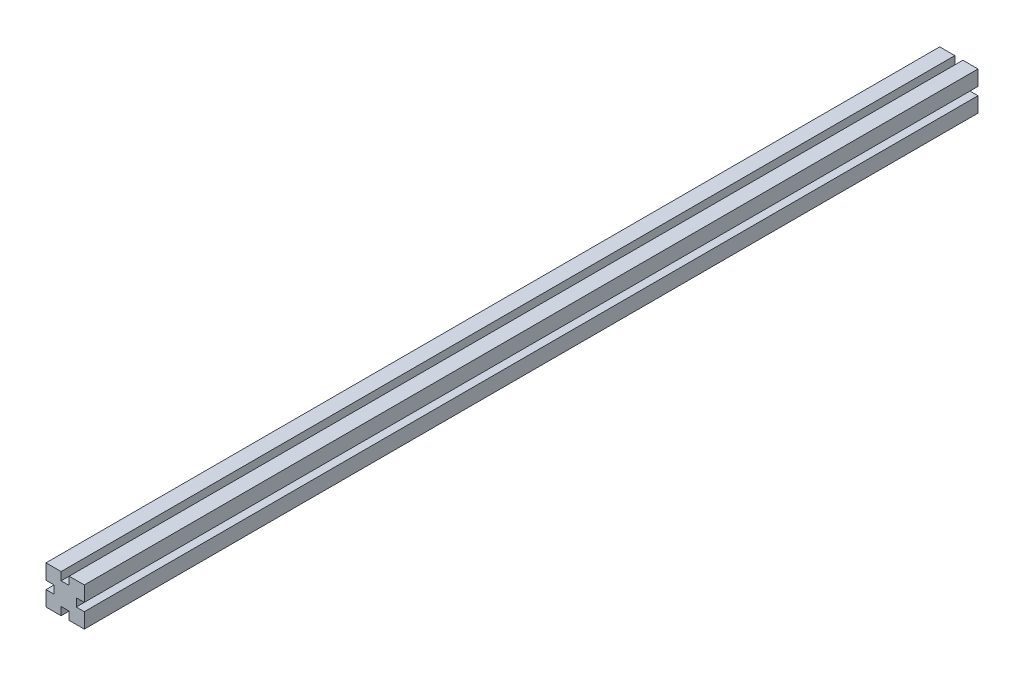
ISO-10303-21;
HEADER;
FILE_DESCRIPTION(('STEP AP214'),'2;1');
FILE_NAME('part.step','',(''),(''),'','','');
FILE_SCHEMA(('AUTOMOTIVE_DESIGN { 1 0 10303 214 1 1 1 1 }'));
ENDSEC;
DATA;
#1=APPLICATION_CONTEXT('core data for automotive mechanical design processes');
#2=APPLICATION_PROTOCOL_DEFINITION('international standard','automotive_design',2000,#1);
#3=PRODUCT_CONTEXT('',#1,'mechanical');
#4=PRODUCT('Part','Part','',(#3));
#5=PRODUCT_RELATED_PRODUCT_CATEGORY('part','',(#4));
#6=PRODUCT_DEFINITION_FORMATION('','',#4);
#7=PRODUCT_DEFINITION_CONTEXT('part definition',#1,'design');
#8=PRODUCT_DEFINITION('design','',#6,#7);
#9=PRODUCT_DEFINITION_SHAPE('','',#8);
#10=(LENGTH_UNIT() NAMED_UNIT(*) SI_UNIT(.MILLI.,.METRE.));
#11=(NAMED_UNIT(*) PLANE_ANGLE_UNIT() SI_UNIT($,.RADIAN.));
#12=(NAMED_UNIT(*) SI_UNIT($,.STERADIAN.) SOLID_ANGLE_UNIT());
#13=UNCERTAINTY_MEASURE_WITH_UNIT(LENGTH_MEASURE(1.E-05),#10,'distance_accuracy_value','');
#14=(GEOMETRIC_REPRESENTATION_CONTEXT(3) GLOBAL_UNCERTAINTY_ASSIGNED_CONTEXT((#13)) GLOBAL_UNIT_ASSIGNED_CONTEXT((#10,
#11,#12)) REPRESENTATION_CONTEXT('',''));
#15=CARTESIAN_POINT('',(0.,0.,0.));
#16=DIRECTION('',(0.,0.,1.));
#17=DIRECTION('',(1.,0.,0.));
#18=AXIS2_PLACEMENT_3D('',#15,#16,#17);
#19=CARTESIAN_POINT('',(-19.05,-4.,889.));
#20=DIRECTION('',(1.,0.,0.));
#21=DIRECTION('',(0.,0.,-1.));
#22=AXIS2_PLACEMENT_3D('',#19,#20,#21);
#23=PLANE('',#22);
#24=DIRECTION('',(0.,-1.,0.));
#25=VECTOR('',#24,1.);
#26=CARTESIAN_POINT('',(-19.05,-4.,0.));
#27=LINE('',#26,#25);
#28=CARTESIAN_POINT('',(-19.05,-4.,0.));
#29=VERTEX_POINT('',#28);
#30=CARTESIAN_POINT('',(-19.05,-19.05,0.));
#31=VERTEX_POINT('',#30);
#32=EDGE_CURVE('E207',#29,#31,#27,.T.);
#33=ORIENTED_EDGE('',*,*,#32,.T.);
#34=DIRECTION('',(0.,0.,-1.));
#35=VECTOR('',#34,1.);
#36=CARTESIAN_POINT('',(-19.05,-19.05,889.));
#37=LINE('',#36,#35);
#38=CARTESIAN_POINT('',(-19.05,-19.05,889.));
#39=VERTEX_POINT('',#38);
#40=EDGE_CURVE('E11',#39,#31,#37,.T.);
#41=ORIENTED_EDGE('',*,*,#40,.F.);
#42=DIRECTION('',(0.,-1.,0.));
#43=VECTOR('',#42,1.);
#44=CARTESIAN_POINT('',(-19.05,-4.,889.));
#45=LINE('',#44,#43);
#46=CARTESIAN_POINT('',(-19.05,-4.,889.));
#47=VERTEX_POINT('',#46);
#48=EDGE_CURVE('E245',#47,#39,#45,.T.);
#49=ORIENTED_EDGE('',*,*,#48,.F.);
#50=DIRECTION('',(0.,0.,-1.));
#51=VECTOR('',#50,1.);
#52=CARTESIAN_POINT('',(-19.05,-4.,889.));
#53=LINE('',#52,#51);
#54=EDGE_CURVE('E203',#47,#29,#53,.T.);
#55=ORIENTED_EDGE('',*,*,#54,.T.);
#56=EDGE_LOOP('',(#33,#41,#49,#55));
#57=FACE_BOUND('',#56,.T.);
#58=ADVANCED_FACE('F39',(#57),#23,.F.);
#59=CARTESIAN_POINT('',(-19.05,-19.05,889.));
#60=DIRECTION('',(0.,1.,0.));
#61=DIRECTION('',(0.,0.,1.));
#62=AXIS2_PLACEMENT_3D('',#59,#60,#61);
#63=PLANE('',#62);
#64=DIRECTION('',(1.,0.,0.));
#65=VECTOR('',#64,1.);
#66=CARTESIAN_POINT('',(-19.05,-19.05,0.));
#67=LINE('',#66,#65);
#68=CARTESIAN_POINT('',(-4.,-19.05,0.));
#69=VERTEX_POINT('',#68);
#70=EDGE_CURVE('E210',#31,#69,#67,.T.);
#71=ORIENTED_EDGE('',*,*,#70,.T.);
#72=DIRECTION('',(0.,0.,-1.));
#73=VECTOR('',#72,1.);
#74=CARTESIAN_POINT('',(-4.,-19.05,889.));
#75=LINE('',#74,#73);
#76=CARTESIAN_POINT('',(-4.,-19.05,889.));
#77=VERTEX_POINT('',#76);
#78=EDGE_CURVE('E47',#77,#69,#75,.T.);
#79=ORIENTED_EDGE('',*,*,#78,.F.);
#80=DIRECTION('',(1.,0.,0.));
#81=VECTOR('',#80,1.);
#82=CARTESIAN_POINT('',(-19.05,-19.05,889.));
#83=LINE('',#82,#81);
#84=EDGE_CURVE('E134',#39,#77,#83,.T.);
#85=ORIENTED_EDGE('',*,*,#84,.F.);
#86=ORIENTED_EDGE('',*,*,#40,.T.);
#87=EDGE_LOOP('',(#71,#79,#85,#86));
#88=FACE_BOUND('',#87,.T.);
#89=ADVANCED_FACE('F363',(#88),#63,.F.);
#90=CARTESIAN_POINT('',(-4.,-19.05,889.));
#91=DIRECTION('',(-1.,0.,0.));
#92=DIRECTION('',(0.,0.,1.));
#93=AXIS2_PLACEMENT_3D('',#90,#91,#92);
#94=PLANE('',#93);
#95=DIRECTION('',(0.,1.,0.));
#96=VECTOR('',#95,1.);
#97=CARTESIAN_POINT('',(-4.,-19.05,0.));
#98=LINE('',#97,#96);
#99=CARTESIAN_POINT('',(-4.,-11.05,0.));
#100=VERTEX_POINT('',#99);
#101=EDGE_CURVE('E212',#69,#100,#98,.T.);
#102=ORIENTED_EDGE('',*,*,#101,.T.);
#103=DIRECTION('',(0.,0.,-1.));
#104=VECTOR('',#103,1.);
#105=CARTESIAN_POINT('',(-4.,-11.05,889.));
#106=LINE('',#105,#104);
#107=CARTESIAN_POINT('',(-4.,-11.05,889.));
#108=VERTEX_POINT('',#107);
#109=EDGE_CURVE('E288',#108,#100,#106,.T.);
#110=ORIENTED_EDGE('',*,*,#109,.F.);
#111=DIRECTION('',(0.,1.,0.));
#112=VECTOR('',#111,1.);
#113=CARTESIAN_POINT('',(-4.,-19.05,889.));
#114=LINE('',#113,#112);
#115=EDGE_CURVE('E296',#77,#108,#114,.T.);
#116=ORIENTED_EDGE('',*,*,#115,.F.);
#117=ORIENTED_EDGE('',*,*,#78,.T.);
#118=EDGE_LOOP('',(#102,#110,#116,#117));
#119=FACE_BOUND('',#118,.T.);
#120=ADVANCED_FACE('F294',(#119),#94,.F.);
#121=CARTESIAN_POINT('',(-4.,-11.05,889.));
#122=DIRECTION('',(0.,1.,0.));
#123=DIRECTION('',(0.,0.,1.));
#124=AXIS2_PLACEMENT_3D('',#121,#122,#123);
#125=PLANE('',#124);
#126=DIRECTION('',(1.,0.,0.));
#127=VECTOR('',#126,1.);
#128=CARTESIAN_POINT('',(-4.,-11.05,0.));
#129=LINE('',#128,#127);
#130=CARTESIAN_POINT('',(4.,-11.05,0.));
#131=VERTEX_POINT('',#130);
#132=EDGE_CURVE('E214',#100,#131,#129,.T.);
#133=ORIENTED_EDGE('',*,*,#132,.T.);
#134=DIRECTION('',(0.,0.,-1.));
#135=VECTOR('',#134,1.);
#136=CARTESIAN_POINT('',(4.,-11.05,889.));
#137=LINE('',#136,#135);
#138=CARTESIAN_POINT('',(4.,-11.05,889.));
#139=VERTEX_POINT('',#138);
#140=EDGE_CURVE('E285',#139,#131,#137,.T.);
#141=ORIENTED_EDGE('',*,*,#140,.F.);
#142=DIRECTION('',(1.,0.,0.));
#143=VECTOR('',#142,1.);
#144=CARTESIAN_POINT('',(-4.,-11.05,889.));
#145=LINE('',#144,#143);
#146=EDGE_CURVE('E314',#108,#139,#145,.T.);
#147=ORIENTED_EDGE('',*,*,#146,.F.);
#148=ORIENTED_EDGE('',*,*,#109,.T.);
#149=EDGE_LOOP('',(#133,#141,#147,#148));
#150=FACE_BOUND('',#149,.T.);
#151=ADVANCED_FACE('F305',(#150),#125,.F.);
#152=CARTESIAN_POINT('',(4.,-11.05,889.));
#153=DIRECTION('',(1.,0.,0.));
#154=DIRECTION('',(0.,0.,-1.));
#155=AXIS2_PLACEMENT_3D('',#152,#153,#154);
#156=PLANE('',#155);
#157=DIRECTION('',(0.,-1.,0.));
#158=VECTOR('',#157,1.);
#159=CARTESIAN_POINT('',(4.,-11.05,0.));
#160=LINE('',#159,#158);
#161=CARTESIAN_POINT('',(4.,-19.05,0.));
#162=VERTEX_POINT('',#161);
#163=EDGE_CURVE('E216',#131,#162,#160,.T.);
#164=ORIENTED_EDGE('',*,*,#163,.T.);
#165=DIRECTION('',(0.,0.,-1.));
#166=VECTOR('',#165,1.);
#167=CARTESIAN_POINT('',(4.,-19.05,889.));
#168=LINE('',#167,#166);
#169=CARTESIAN_POINT('',(4.,-19.05,889.));
#170=VERTEX_POINT('',#169);
#171=EDGE_CURVE('E282',#170,#162,#168,.T.);
#172=ORIENTED_EDGE('',*,*,#171,.F.);
#173=DIRECTION('',(0.,-1.,0.));
#174=VECTOR('',#173,1.);
#175=CARTESIAN_POINT('',(4.,-11.05,889.));
#176=LINE('',#175,#174);
#177=EDGE_CURVE('E311',#139,#170,#176,.T.);
#178=ORIENTED_EDGE('',*,*,#177,.F.);
#179=ORIENTED_EDGE('',*,*,#140,.T.);
#180=EDGE_LOOP('',(#164,#172,#178,#179));
#181=FACE_BOUND('',#180,.T.);
#182=ADVANCED_FACE('F309',(#181),#156,.F.);
#183=CARTESIAN_POINT('',(4.,-19.05,889.));
#184=DIRECTION('',(0.,1.,0.));
#185=DIRECTION('',(0.,0.,1.));
#186=AXIS2_PLACEMENT_3D('',#183,#184,#185);
#187=PLANE('',#186);
#188=DIRECTION('',(1.,0.,0.));
#189=VECTOR('',#188,1.);
#190=CARTESIAN_POINT('',(4.,-19.05,0.));
#191=LINE('',#190,#189);
#192=CARTESIAN_POINT('',(19.05,-19.05,0.));
#193=VERTEX_POINT('',#192);
#194=EDGE_CURVE('E218',#162,#193,#191,.T.);
#195=ORIENTED_EDGE('',*,*,#194,.T.);
#196=DIRECTION('',(0.,0.,-1.));
#197=VECTOR('',#196,1.);
#198=CARTESIAN_POINT('',(19.05,-19.05,889.));
#199=LINE('',#198,#197);
#200=CARTESIAN_POINT('',(19.05,-19.05,889.));
#201=VERTEX_POINT('',#200);
#202=EDGE_CURVE('E279',#201,#193,#199,.T.);
#203=ORIENTED_EDGE('',*,*,#202,.F.);
#204=DIRECTION('',(1.,0.,0.));
#205=VECTOR('',#204,1.);
#206=CARTESIAN_POINT('',(4.,-19.05,889.));
#207=LINE('',#206,#205);
#208=EDGE_CURVE('E313',#170,#201,#207,.T.);
#209=ORIENTED_EDGE('',*,*,#208,.F.);
#210=ORIENTED_EDGE('',*,*,#171,.T.);
#211=EDGE_LOOP('',(#195,#203,#209,#210));
#212=FACE_BOUND('',#211,.T.);
#213=ADVANCED_FACE('F376',(#212),#187,.F.);
#214=CARTESIAN_POINT('',(19.05,-19.05,889.));
#215=DIRECTION('',(-1.,0.,0.));
#216=DIRECTION('',(0.,0.,1.));
#217=AXIS2_PLACEMENT_3D('',#214,#215,#216);
#218=PLANE('',#217);
#219=DIRECTION('',(0.,1.,0.));
#220=VECTOR('',#219,1.);
#221=CARTESIAN_POINT('',(19.05,-19.05,0.));
#222=LINE('',#221,#220);
#223=CARTESIAN_POINT('',(19.05,-4.,0.));
#224=VERTEX_POINT('',#223);
#225=EDGE_CURVE('E220',#193,#224,#222,.T.);
#226=ORIENTED_EDGE('',*,*,#225,.T.);
#227=DIRECTION('',(0.,0.,-1.));
#228=VECTOR('',#227,1.);
#229=CARTESIAN_POINT('',(19.05,-4.,889.));
#230=LINE('',#229,#228);
#231=CARTESIAN_POINT('',(19.05,-4.,889.));
#232=VERTEX_POINT('',#231);
#233=EDGE_CURVE('E276',#232,#224,#230,.T.);
#234=ORIENTED_EDGE('',*,*,#233,.F.);
#235=DIRECTION('',(0.,1.,0.));
#236=VECTOR('',#235,1.);
#237=CARTESIAN_POINT('',(19.05,-19.05,889.));
#238=LINE('',#237,#236);
#239=EDGE_CURVE('E316',#201,#232,#238,.T.);
#240=ORIENTED_EDGE('',*,*,#239,.F.);
#241=ORIENTED_EDGE('',*,*,#202,.T.);
#242=EDGE_LOOP('',(#226,#234,#240,#241));
#243=FACE_BOUND('',#242,.T.);
#244=ADVANCED_FACE('F379',(#243),#218,.F.);
#245=CARTESIAN_POINT('',(19.05,-4.,889.));
#246=DIRECTION('',(0.,-1.,0.));
#247=DIRECTION('',(0.,0.,-1.));
#248=AXIS2_PLACEMENT_3D('',#245,#246,#247);
#249=PLANE('',#248);
#250=DIRECTION('',(-1.,0.,0.));
#251=VECTOR('',#250,1.);
#252=CARTESIAN_POINT('',(19.05,-4.,0.));
#253=LINE('',#252,#251);
#254=CARTESIAN_POINT('',(11.05,-4.,0.));
#255=VERTEX_POINT('',#254);
#256=EDGE_CURVE('E222',#224,#255,#253,.T.);
#257=ORIENTED_EDGE('',*,*,#256,.T.);
#258=DIRECTION('',(0.,0.,-1.));
#259=VECTOR('',#258,1.);
#260=CARTESIAN_POINT('',(11.05,-4.,889.));
#261=LINE('',#260,#259);
#262=CARTESIAN_POINT('',(11.05,-4.,889.));
#263=VERTEX_POINT('',#262);
#264=EDGE_CURVE('E273',#263,#255,#261,.T.);
#265=ORIENTED_EDGE('',*,*,#264,.F.);
#266=DIRECTION('',(-1.,0.,0.));
#267=VECTOR('',#266,1.);
#268=CARTESIAN_POINT('',(19.05,-4.,889.));
#269=LINE('',#268,#267);
#270=EDGE_CURVE('E322',#232,#263,#269,.T.);
#271=ORIENTED_EDGE('',*,*,#270,.F.);
#272=ORIENTED_EDGE('',*,*,#233,.T.);
#273=EDGE_LOOP('',(#257,#265,#271,#272));
#274=FACE_BOUND('',#273,.T.);
#275=ADVANCED_FACE('F383',(#274),#249,.F.);
#276=CARTESIAN_POINT('',(11.05,-4.,889.));
#277=DIRECTION('',(-1.,0.,0.));
#278=DIRECTION('',(0.,0.,1.));
#279=AXIS2_PLACEMENT_3D('',#276,#277,#278);
#280=PLANE('',#279);
#281=DIRECTION('',(0.,1.,0.));
#282=VECTOR('',#281,1.);
#283=CARTESIAN_POINT('',(11.05,-4.,0.));
#284=LINE('',#283,#282);
#285=CARTESIAN_POINT('',(11.05,4.,0.));
#286=VERTEX_POINT('',#285);
#287=EDGE_CURVE('E224',#255,#286,#284,.T.);
#288=ORIENTED_EDGE('',*,*,#287,.T.);
#289=DIRECTION('',(0.,0.,-1.));
#290=VECTOR('',#289,1.);
#291=CARTESIAN_POINT('',(11.05,4.,889.));
#292=LINE('',#291,#290);
#293=CARTESIAN_POINT('',(11.05,4.,889.));
#294=VERTEX_POINT('',#293);
#295=EDGE_CURVE('E270',#294,#286,#292,.T.);
#296=ORIENTED_EDGE('',*,*,#295,.F.);
#297=DIRECTION('',(0.,1.,0.));
#298=VECTOR('',#297,1.);
#299=CARTESIAN_POINT('',(11.05,-4.,889.));
#300=LINE('',#299,#298);
#301=EDGE_CURVE('E324',#263,#294,#300,.T.);
#302=ORIENTED_EDGE('',*,*,#301,.F.);
#303=ORIENTED_EDGE('',*,*,#264,.T.);
#304=EDGE_LOOP('',(#288,#296,#302,#303));
#305=FACE_BOUND('',#304,.T.);
#306=ADVANCED_FACE('F387',(#305),#280,.F.);
#307=CARTESIAN_POINT('',(11.05,4.,889.));
#308=DIRECTION('',(0.,1.,0.));
#309=DIRECTION('',(0.,0.,1.));
#310=AXIS2_PLACEMENT_3D('',#307,#308,#309);
#311=PLANE('',#310);
#312=DIRECTION('',(1.,0.,0.));
#313=VECTOR('',#312,1.);
#314=CARTESIAN_POINT('',(11.05,4.,0.));
#315=LINE('',#314,#313);
#316=CARTESIAN_POINT('',(19.05,4.,0.));
#317=VERTEX_POINT('',#316);
#318=EDGE_CURVE('E226',#286,#317,#315,.T.);
#319=ORIENTED_EDGE('',*,*,#318,.T.);
#320=DIRECTION('',(0.,0.,-1.));
#321=VECTOR('',#320,1.);
#322=CARTESIAN_POINT('',(19.05,4.,889.));
#323=LINE('',#322,#321);
#324=CARTESIAN_POINT('',(19.05,4.,889.));
#325=VERTEX_POINT('',#324);
#326=EDGE_CURVE('E267',#325,#317,#323,.T.);
#327=ORIENTED_EDGE('',*,*,#326,.F.);
#328=DIRECTION('',(1.,0.,0.));
#329=VECTOR('',#328,1.);
#330=CARTESIAN_POINT('',(11.05,4.,889.));
#331=LINE('',#330,#329);
#332=EDGE_CURVE('E326',#294,#325,#331,.T.);
#333=ORIENTED_EDGE('',*,*,#332,.F.);
#334=ORIENTED_EDGE('',*,*,#295,.T.);
#335=EDGE_LOOP('',(#319,#327,#333,#334));
#336=FACE_BOUND('',#335,.T.);
#337=ADVANCED_FACE('F391',(#336),#311,.F.);
#338=CARTESIAN_POINT('',(19.05,4.,889.));
#339=DIRECTION('',(-1.,0.,0.));
#340=DIRECTION('',(0.,0.,1.));
#341=AXIS2_PLACEMENT_3D('',#338,#339,#340);
#342=PLANE('',#341);
#343=DIRECTION('',(0.,1.,0.));
#344=VECTOR('',#343,1.);
#345=CARTESIAN_POINT('',(19.05,4.,0.));
#346=LINE('',#345,#344);
#347=CARTESIAN_POINT('',(19.05,19.05,0.));
#348=VERTEX_POINT('',#347);
#349=EDGE_CURVE('E228',#317,#348,#346,.T.);
#350=ORIENTED_EDGE('',*,*,#349,.T.);
#351=DIRECTION('',(0.,0.,-1.));
#352=VECTOR('',#351,1.);
#353=CARTESIAN_POINT('',(19.05,19.05,889.));
#354=LINE('',#353,#352);
#355=CARTESIAN_POINT('',(19.05,19.05,889.));
#356=VERTEX_POINT('',#355);
#357=EDGE_CURVE('E264',#356,#348,#354,.T.);
#358=ORIENTED_EDGE('',*,*,#357,.F.);
#359=DIRECTION('',(0.,1.,0.));
#360=VECTOR('',#359,1.);
#361=CARTESIAN_POINT('',(19.05,4.,889.));
#362=LINE('',#361,#360);
#363=EDGE_CURVE('E328',#325,#356,#362,.T.);
#364=ORIENTED_EDGE('',*,*,#363,.F.);
#365=ORIENTED_EDGE('',*,*,#326,.T.);
#366=EDGE_LOOP('',(#350,#358,#364,#365));
#367=FACE_BOUND('',#366,.T.);
#368=ADVANCED_FACE('F395',(#367),#342,.F.);
#369=CARTESIAN_POINT('',(19.05,19.05,889.));
#370=DIRECTION('',(0.,-1.,0.));
#371=DIRECTION('',(0.,0.,-1.));
#372=AXIS2_PLACEMENT_3D('',#369,#370,#371);
#373=PLANE('',#372);
#374=DIRECTION('',(-1.,0.,0.));
#375=VECTOR('',#374,1.);
#376=CARTESIAN_POINT('',(19.05,19.05,0.));
#377=LINE('',#376,#375);
#378=CARTESIAN_POINT('',(4.,19.05,0.));
#379=VERTEX_POINT('',#378);
#380=EDGE_CURVE('E230',#348,#379,#377,.T.);
#381=ORIENTED_EDGE('',*,*,#380,.T.);
#382=DIRECTION('',(0.,0.,-1.));
#383=VECTOR('',#382,1.);
#384=CARTESIAN_POINT('',(4.,19.05,889.));
#385=LINE('',#384,#383);
#386=CARTESIAN_POINT('',(4.,19.05,889.));
#387=VERTEX_POINT('',#386);
#388=EDGE_CURVE('E261',#387,#379,#385,.T.);
#389=ORIENTED_EDGE('',*,*,#388,.F.);
#390=DIRECTION('',(-1.,0.,0.));
#391=VECTOR('',#390,1.);
#392=CARTESIAN_POINT('',(19.05,19.05,889.));
#393=LINE('',#392,#391);
#394=EDGE_CURVE('E330',#356,#387,#393,.T.);
#395=ORIENTED_EDGE('',*,*,#394,.F.);
#396=ORIENTED_EDGE('',*,*,#357,.T.);
#397=EDGE_LOOP('',(#381,#389,#395,#396));
#398=FACE_BOUND('',#397,.T.);
#399=ADVANCED_FACE('F399',(#398),#373,.F.);
#400=CARTESIAN_POINT('',(4.,19.05,889.));
#401=DIRECTION('',(1.,0.,0.));
#402=DIRECTION('',(0.,0.,-1.));
#403=AXIS2_PLACEMENT_3D('',#400,#401,#402);
#404=PLANE('',#403);
#405=DIRECTION('',(0.,-1.,0.));
#406=VECTOR('',#405,1.);
#407=CARTESIAN_POINT('',(4.,19.05,0.));
#408=LINE('',#407,#406);
#409=CARTESIAN_POINT('',(4.,11.05,0.));
#410=VERTEX_POINT('',#409);
#411=EDGE_CURVE('E232',#379,#410,#408,.T.);
#412=ORIENTED_EDGE('',*,*,#411,.T.);
#413=DIRECTION('',(0.,0.,-1.));
#414=VECTOR('',#413,1.);
#415=CARTESIAN_POINT('',(4.,11.05,889.));
#416=LINE('',#415,#414);
#417=CARTESIAN_POINT('',(4.,11.05,889.));
#418=VERTEX_POINT('',#417);
#419=EDGE_CURVE('E258',#418,#410,#416,.T.);
#420=ORIENTED_EDGE('',*,*,#419,.F.);
#421=DIRECTION('',(0.,-1.,0.));
#422=VECTOR('',#421,1.);
#423=CARTESIAN_POINT('',(4.,19.05,889.));
#424=LINE('',#423,#422);
#425=EDGE_CURVE('E332',#387,#418,#424,.T.);
#426=ORIENTED_EDGE('',*,*,#425,.F.);
#427=ORIENTED_EDGE('',*,*,#388,.T.);
#428=EDGE_LOOP('',(#412,#420,#426,#427));
#429=FACE_BOUND('',#428,.T.);
#430=ADVANCED_FACE('F403',(#429),#404,.F.);
#431=CARTESIAN_POINT('',(4.,11.05,889.));
#432=DIRECTION('',(0.,-1.,0.));
#433=DIRECTION('',(0.,0.,-1.));
#434=AXIS2_PLACEMENT_3D('',#431,#432,#433);
#435=PLANE('',#434);
#436=DIRECTION('',(-1.,0.,0.));
#437=VECTOR('',#436,1.);
#438=CARTESIAN_POINT('',(4.,11.05,0.));
#439=LINE('',#438,#437);
#440=CARTESIAN_POINT('',(-4.,11.05,0.));
#441=VERTEX_POINT('',#440);
#442=EDGE_CURVE('E234',#410,#441,#439,.T.);
#443=ORIENTED_EDGE('',*,*,#442,.T.);
#444=DIRECTION('',(0.,0.,-1.));
#445=VECTOR('',#444,1.);
#446=CARTESIAN_POINT('',(-4.,11.05,889.));
#447=LINE('',#446,#445);
#448=CARTESIAN_POINT('',(-4.,11.05,889.));
#449=VERTEX_POINT('',#448);
#450=EDGE_CURVE('E255',#449,#441,#447,.T.);
#451=ORIENTED_EDGE('',*,*,#450,.F.);
#452=DIRECTION('',(-1.,0.,0.));
#453=VECTOR('',#452,1.);
#454=CARTESIAN_POINT('',(4.,11.05,889.));
#455=LINE('',#454,#453);
#456=EDGE_CURVE('E334',#418,#449,#455,.T.);
#457=ORIENTED_EDGE('',*,*,#456,.F.);
#458=ORIENTED_EDGE('',*,*,#419,.T.);
#459=EDGE_LOOP('',(#443,#451,#457,#458));
#460=FACE_BOUND('',#459,.T.);
#461=ADVANCED_FACE('F407',(#460),#435,.F.);
#462=CARTESIAN_POINT('',(-4.,11.05,889.));
#463=DIRECTION('',(-1.,0.,0.));
#464=DIRECTION('',(0.,0.,1.));
#465=AXIS2_PLACEMENT_3D('',#462,#463,#464);
#466=PLANE('',#465);
#467=DIRECTION('',(0.,1.,0.));
#468=VECTOR('',#467,1.);
#469=CARTESIAN_POINT('',(-4.,11.05,0.));
#470=LINE('',#469,#468);
#471=CARTESIAN_POINT('',(-4.,19.05,0.));
#472=VERTEX_POINT('',#471);
#473=EDGE_CURVE('E236',#441,#472,#470,.T.);
#474=ORIENTED_EDGE('',*,*,#473,.T.);
#475=DIRECTION('',(0.,0.,-1.));
#476=VECTOR('',#475,1.);
#477=CARTESIAN_POINT('',(-4.,19.05,889.));
#478=LINE('',#477,#476);
#479=CARTESIAN_POINT('',(-4.,19.05,889.));
#480=VERTEX_POINT('',#479);
#481=EDGE_CURVE('E252',#480,#472,#478,.T.);
#482=ORIENTED_EDGE('',*,*,#481,.F.);
#483=DIRECTION('',(0.,1.,0.));
#484=VECTOR('',#483,1.);
#485=CARTESIAN_POINT('',(-4.,11.05,889.));
#486=LINE('',#485,#484);
#487=EDGE_CURVE('E336',#449,#480,#486,.T.);
#488=ORIENTED_EDGE('',*,*,#487,.F.);
#489=ORIENTED_EDGE('',*,*,#450,.T.);
#490=EDGE_LOOP('',(#474,#482,#488,#489));
#491=FACE_BOUND('',#490,.T.);
#492=ADVANCED_FACE('F411',(#491),#466,.F.);
#493=CARTESIAN_POINT('',(-4.,19.05,889.));
#494=DIRECTION('',(0.,-1.,0.));
#495=DIRECTION('',(0.,0.,-1.));
#496=AXIS2_PLACEMENT_3D('',#493,#494,#495);
#497=PLANE('',#496);
#498=DIRECTION('',(-1.,0.,0.));
#499=VECTOR('',#498,1.);
#500=CARTESIAN_POINT('',(-4.,19.05,0.));
#501=LINE('',#500,#499);
#502=CARTESIAN_POINT('',(-19.05,19.05,0.));
#503=VERTEX_POINT('',#502);
#504=EDGE_CURVE('E238',#472,#503,#501,.T.);
#505=ORIENTED_EDGE('',*,*,#504,.T.);
#506=DIRECTION('',(0.,0.,-1.));
#507=VECTOR('',#506,1.);
#508=CARTESIAN_POINT('',(-19.05,19.05,889.));
#509=LINE('',#508,#507);
#510=CARTESIAN_POINT('',(-19.05,19.05,889.));
#511=VERTEX_POINT('',#510);
#512=EDGE_CURVE('E249',#511,#503,#509,.T.);
#513=ORIENTED_EDGE('',*,*,#512,.F.);
#514=DIRECTION('',(-1.,0.,0.));
#515=VECTOR('',#514,1.);
#516=CARTESIAN_POINT('',(-4.,19.05,889.));
#517=LINE('',#516,#515);
#518=EDGE_CURVE('E338',#480,#511,#517,.T.);
#519=ORIENTED_EDGE('',*,*,#518,.F.);
#520=ORIENTED_EDGE('',*,*,#481,.T.);
#521=EDGE_LOOP('',(#505,#513,#519,#520));
#522=FACE_BOUND('',#521,.T.);
#523=ADVANCED_FACE('F344',(#522),#497,.F.);
#524=CARTESIAN_POINT('',(-19.05,19.05,889.));
#525=DIRECTION('',(1.,0.,0.));
#526=DIRECTION('',(0.,0.,-1.));
#527=AXIS2_PLACEMENT_3D('',#524,#525,#526);
#528=PLANE('',#527);
#529=DIRECTION('',(0.,-1.,0.));
#530=VECTOR('',#529,1.);
#531=CARTESIAN_POINT('',(-19.05,19.05,0.));
#532=LINE('',#531,#530);
#533=CARTESIAN_POINT('',(-19.05,4.,0.));
#534=VERTEX_POINT('',#533);
#535=EDGE_CURVE('E240',#503,#534,#532,.T.);
#536=ORIENTED_EDGE('',*,*,#535,.T.);
#537=DIRECTION('',(0.,0.,-1.));
#538=VECTOR('',#537,1.);
#539=CARTESIAN_POINT('',(-19.05,4.,889.));
#540=LINE('',#539,#538);
#541=CARTESIAN_POINT('',(-19.05,4.,889.));
#542=VERTEX_POINT('',#541);
#543=EDGE_CURVE('E198',#542,#534,#540,.T.);
#544=ORIENTED_EDGE('',*,*,#543,.F.);
#545=DIRECTION('',(0.,-1.,0.));
#546=VECTOR('',#545,1.);
#547=CARTESIAN_POINT('',(-19.05,19.05,889.));
#548=LINE('',#547,#546);
#549=EDGE_CURVE('E189',#511,#542,#548,.T.);
#550=ORIENTED_EDGE('',*,*,#549,.F.);
#551=ORIENTED_EDGE('',*,*,#512,.T.);
#552=EDGE_LOOP('',(#536,#544,#550,#551));
#553=FACE_BOUND('',#552,.T.);
#554=ADVANCED_FACE('F348',(#553),#528,.F.);
#555=CARTESIAN_POINT('',(-19.05,4.,889.));
#556=DIRECTION('',(0.,1.,0.));
#557=DIRECTION('',(0.,0.,1.));
#558=AXIS2_PLACEMENT_3D('',#555,#556,#557);
#559=PLANE('',#558);
#560=DIRECTION('',(1.,0.,0.));
#561=VECTOR('',#560,1.);
#562=CARTESIAN_POINT('',(-19.05,4.,0.));
#563=LINE('',#562,#561);
#564=CARTESIAN_POINT('',(-11.05,4.,0.));
#565=VERTEX_POINT('',#564);
#566=EDGE_CURVE('E197',#534,#565,#563,.T.);
#567=ORIENTED_EDGE('',*,*,#566,.T.);
#568=DIRECTION('',(0.,0.,-1.));
#569=VECTOR('',#568,1.);
#570=CARTESIAN_POINT('',(-11.05,4.,889.));
#571=LINE('',#570,#569);
#572=CARTESIAN_POINT('',(-11.05,4.,889.));
#573=VERTEX_POINT('',#572);
#574=EDGE_CURVE('E194',#573,#565,#571,.T.);
#575=ORIENTED_EDGE('',*,*,#574,.F.);
#576=DIRECTION('',(1.,0.,0.));
#577=VECTOR('',#576,1.);
#578=CARTESIAN_POINT('',(-19.05,4.,889.));
#579=LINE('',#578,#577);
#580=EDGE_CURVE('E183',#542,#573,#579,.T.);
#581=ORIENTED_EDGE('',*,*,#580,.F.);
#582=ORIENTED_EDGE('',*,*,#543,.T.);
#583=EDGE_LOOP('',(#567,#575,#581,#582));
#584=FACE_BOUND('',#583,.T.);
#585=ADVANCED_FACE('F195',(#584),#559,.F.);
#586=CARTESIAN_POINT('',(-11.05,4.,889.));
#587=DIRECTION('',(1.,0.,0.));
#588=DIRECTION('',(0.,0.,-1.));
#589=AXIS2_PLACEMENT_3D('',#586,#587,#588);
#590=PLANE('',#589);
#591=DIRECTION('',(0.,-1.,0.));
#592=VECTOR('',#591,1.);
#593=CARTESIAN_POINT('',(-11.05,4.,0.));
#594=LINE('',#593,#592);
#595=CARTESIAN_POINT('',(-11.05,-4.,0.));
#596=VERTEX_POINT('',#595);
#597=EDGE_CURVE('E120',#565,#596,#594,.T.);
#598=ORIENTED_EDGE('',*,*,#597,.T.);
#599=DIRECTION('',(0.,0.,-1.));
#600=VECTOR('',#599,1.);
#601=CARTESIAN_POINT('',(-11.05,-4.,889.));
#602=LINE('',#601,#600);
#603=CARTESIAN_POINT('',(-11.05,-4.,889.));
#604=VERTEX_POINT('',#603);
#605=EDGE_CURVE('E199',#604,#596,#602,.T.);
#606=ORIENTED_EDGE('',*,*,#605,.F.);
#607=DIRECTION('',(0.,-1.,0.));
#608=VECTOR('',#607,1.);
#609=CARTESIAN_POINT('',(-11.05,4.,889.));
#610=LINE('',#609,#608);
#611=EDGE_CURVE('E187',#573,#604,#610,.T.);
#612=ORIENTED_EDGE('',*,*,#611,.F.);
#613=ORIENTED_EDGE('',*,*,#574,.T.);
#614=EDGE_LOOP('',(#598,#606,#612,#613));
#615=FACE_BOUND('',#614,.T.);
#616=ADVANCED_FACE('F201',(#615),#590,.F.);
#617=CARTESIAN_POINT('',(-11.05,-4.,889.));
#618=DIRECTION('',(0.,-1.,0.));
#619=DIRECTION('',(0.,0.,-1.));
#620=AXIS2_PLACEMENT_3D('',#617,#618,#619);
#621=PLANE('',#620);
#622=DIRECTION('',(-1.,0.,0.));
#623=VECTOR('',#622,1.);
#624=CARTESIAN_POINT('',(-11.05,-4.,0.));
#625=LINE('',#624,#623);
#626=EDGE_CURVE('E126',#596,#29,#625,.T.);
#627=ORIENTED_EDGE('',*,*,#626,.T.);
#628=ORIENTED_EDGE('',*,*,#54,.F.);
#629=DIRECTION('',(-1.,0.,0.));
#630=VECTOR('',#629,1.);
#631=CARTESIAN_POINT('',(-11.05,-4.,889.));
#632=LINE('',#631,#630);
#633=EDGE_CURVE('E55',#604,#47,#632,.T.);
#634=ORIENTED_EDGE('',*,*,#633,.F.);
#635=ORIENTED_EDGE('',*,*,#605,.T.);
#636=EDGE_LOOP('',(#627,#628,#634,#635));
#637=FACE_BOUND('',#636,.T.);
#638=ADVANCED_FACE('F352',(#637),#621,.F.);
#639=CARTESIAN_POINT('',(0.,0.,889.));
#640=DIRECTION('',(0.,0.,1.));
#641=DIRECTION('',(1.,0.,0.));
#642=AXIS2_PLACEMENT_3D('',#639,#640,#641);
#643=PLANE('',#642);
#644=ORIENTED_EDGE('',*,*,#48,.T.);
#645=ORIENTED_EDGE('',*,*,#84,.T.);
#646=ORIENTED_EDGE('',*,*,#115,.T.);
#647=ORIENTED_EDGE('',*,*,#146,.T.);
#648=ORIENTED_EDGE('',*,*,#177,.T.);
#649=ORIENTED_EDGE('',*,*,#208,.T.);
#650=ORIENTED_EDGE('',*,*,#239,.T.);
#651=ORIENTED_EDGE('',*,*,#270,.T.);
#652=ORIENTED_EDGE('',*,*,#301,.T.);
#653=ORIENTED_EDGE('',*,*,#332,.T.);
#654=ORIENTED_EDGE('',*,*,#363,.T.);
#655=ORIENTED_EDGE('',*,*,#394,.T.);
#656=ORIENTED_EDGE('',*,*,#425,.T.);
#657=ORIENTED_EDGE('',*,*,#456,.T.);
#658=ORIENTED_EDGE('',*,*,#487,.T.);
#659=ORIENTED_EDGE('',*,*,#518,.T.);
#660=ORIENTED_EDGE('',*,*,#549,.T.);
#661=ORIENTED_EDGE('',*,*,#580,.T.);
#662=ORIENTED_EDGE('',*,*,#611,.T.);
#663=ORIENTED_EDGE('',*,*,#633,.T.);
#664=EDGE_LOOP('',(#644,#645,#646,#647,#648,#649,#650,#651,#652,#653,#654,#655,#656,#657,#658,
#659,#660,#661,#662,#663));
#665=FACE_BOUND('',#664,.T.);
#666=ADVANCED_FACE('F185',(#665),#643,.T.);
#667=CARTESIAN_POINT('',(0.,0.,0.));
#668=DIRECTION('',(0.,0.,1.));
#669=DIRECTION('',(1.,0.,0.));
#670=AXIS2_PLACEMENT_3D('',#667,#668,#669);
#671=PLANE('',#670);
#672=ORIENTED_EDGE('',*,*,#32,.F.);
#673=ORIENTED_EDGE('',*,*,#626,.F.);
#674=ORIENTED_EDGE('',*,*,#597,.F.);
#675=ORIENTED_EDGE('',*,*,#566,.F.);
#676=ORIENTED_EDGE('',*,*,#535,.F.);
#677=ORIENTED_EDGE('',*,*,#504,.F.);
#678=ORIENTED_EDGE('',*,*,#473,.F.);
#679=ORIENTED_EDGE('',*,*,#442,.F.);
#680=ORIENTED_EDGE('',*,*,#411,.F.);
#681=ORIENTED_EDGE('',*,*,#380,.F.);
#682=ORIENTED_EDGE('',*,*,#349,.F.);
#683=ORIENTED_EDGE('',*,*,#318,.F.);
#684=ORIENTED_EDGE('',*,*,#287,.F.);
#685=ORIENTED_EDGE('',*,*,#256,.F.);
#686=ORIENTED_EDGE('',*,*,#225,.F.);
#687=ORIENTED_EDGE('',*,*,#194,.F.);
#688=ORIENTED_EDGE('',*,*,#163,.F.);
#689=ORIENTED_EDGE('',*,*,#132,.F.);
#690=ORIENTED_EDGE('',*,*,#101,.F.);
#691=ORIENTED_EDGE('',*,*,#70,.F.);
#692=EDGE_LOOP('',(#672,#673,#674,#675,#676,#677,#678,#679,#680,#681,#682,#683,#684,#685,#686,
#687,#688,#689,#690,#691));
#693=FACE_BOUND('',#692,.T.);
#694=ADVANCED_FACE('F300',(#693),#671,.F.);
#695=CLOSED_SHELL('',(#58,#89,#120,#151,#182,#213,#244,#275,#306,#337,#368,#399,#430,#461,#492,
#523,#554,#585,#616,#638,#666,#694));
#696=MANIFOLD_SOLID_BREP('B2',#695);
#697=ADVANCED_BREP_SHAPE_REPRESENTATION('',(#18,#696),#14);
#698=SHAPE_DEFINITION_REPRESENTATION(#9,#697);
ENDSEC;
END-ISO-10303-21;
